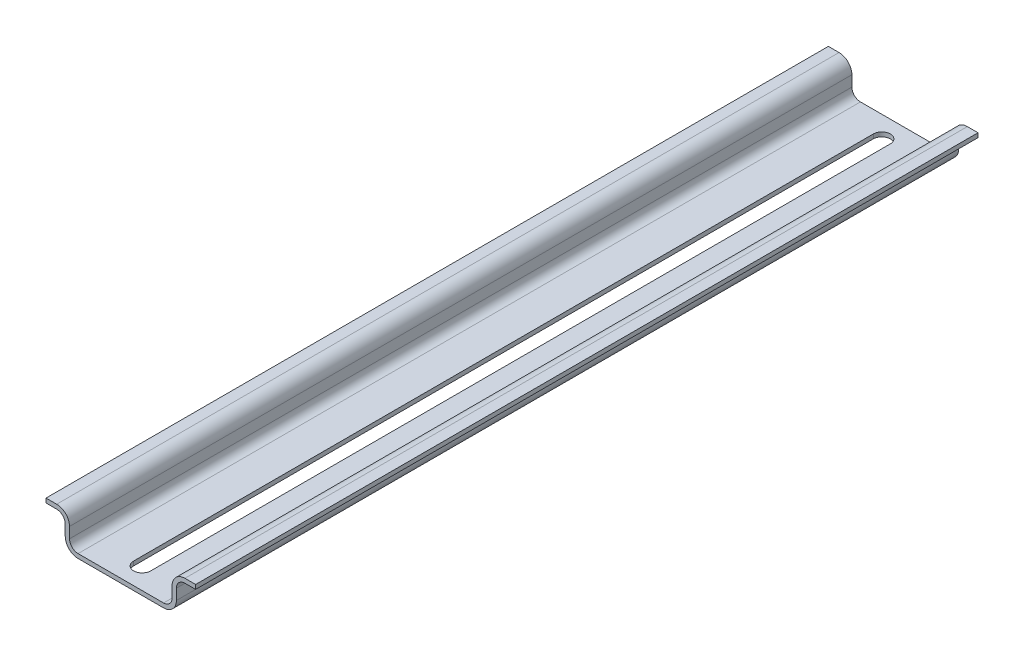
ISO-10303-21;
HEADER;
FILE_DESCRIPTION(('STEP AP214'),'2;1');
FILE_NAME('part.step','',(''),(''),'','','');
FILE_SCHEMA(('AUTOMOTIVE_DESIGN { 1 0 10303 214 1 1 1 1 }'));
ENDSEC;
DATA;
#1=APPLICATION_CONTEXT('core data for automotive mechanical design processes');
#2=APPLICATION_PROTOCOL_DEFINITION('international standard','automotive_design',2000,#1);
#3=PRODUCT_CONTEXT('',#1,'mechanical');
#4=PRODUCT('Part','Part','',(#3));
#5=PRODUCT_RELATED_PRODUCT_CATEGORY('part','',(#4));
#6=PRODUCT_DEFINITION_FORMATION('','',#4);
#7=PRODUCT_DEFINITION_CONTEXT('part definition',#1,'design');
#8=PRODUCT_DEFINITION('design','',#6,#7);
#9=PRODUCT_DEFINITION_SHAPE('','',#8);
#10=(LENGTH_UNIT() NAMED_UNIT(*) SI_UNIT(.MILLI.,.METRE.));
#11=(NAMED_UNIT(*) PLANE_ANGLE_UNIT() SI_UNIT($,.RADIAN.));
#12=(NAMED_UNIT(*) SI_UNIT($,.STERADIAN.) SOLID_ANGLE_UNIT());
#13=UNCERTAINTY_MEASURE_WITH_UNIT(LENGTH_MEASURE(1.E-05),#10,'distance_accuracy_value','');
#14=(GEOMETRIC_REPRESENTATION_CONTEXT(3) GLOBAL_UNCERTAINTY_ASSIGNED_CONTEXT((#13)) GLOBAL_UNIT_ASSIGNED_CONTEXT((#10,
#11,#12)) REPRESENTATION_CONTEXT('',''));
#15=CARTESIAN_POINT('',(0.,0.,0.));
#16=DIRECTION('',(0.,0.,1.));
#17=DIRECTION('',(1.,0.,0.));
#18=AXIS2_PLACEMENT_3D('',#15,#16,#17);
#19=CARTESIAN_POINT('',(0.,-1.72286102748374,183.));
#20=DIRECTION('',(1.,0.,0.));
#21=DIRECTION('',(0.,0.,-1.));
#22=AXIS2_PLACEMENT_3D('',#19,#20,#21);
#23=PLANE('',#22);
#24=DIRECTION('',(0.,-1.,0.));
#25=VECTOR('',#24,1.);
#26=CARTESIAN_POINT('',(0.,-1.72286102748374,0.));
#27=LINE('',#26,#25);
#28=CARTESIAN_POINT('',(0.,-1.72286102748374,0.));
#29=VERTEX_POINT('',#28);
#30=CARTESIAN_POINT('',(0.,-2.72286102748374,0.));
#31=VERTEX_POINT('',#30);
#32=EDGE_CURVE('E206',#29,#31,#27,.T.);
#33=ORIENTED_EDGE('',*,*,#32,.T.);
#34=DIRECTION('',(0.,0.,-1.));
#35=VECTOR('',#34,1.);
#36=CARTESIAN_POINT('',(0.,-2.72286102748374,183.));
#37=LINE('',#36,#35);
#38=CARTESIAN_POINT('',(0.,-2.72286102748374,183.));
#39=VERTEX_POINT('',#38);
#40=EDGE_CURVE('E11',#39,#31,#37,.T.);
#41=ORIENTED_EDGE('',*,*,#40,.F.);
#42=DIRECTION('',(0.,-1.,0.));
#43=VECTOR('',#42,1.);
#44=CARTESIAN_POINT('',(0.,-1.72286102748374,183.));
#45=LINE('',#44,#43);
#46=CARTESIAN_POINT('',(0.,-1.72286102748374,183.));
#47=VERTEX_POINT('',#46);
#48=EDGE_CURVE('E229',#47,#39,#45,.T.);
#49=ORIENTED_EDGE('',*,*,#48,.F.);
#50=DIRECTION('',(0.,0.,-1.));
#51=VECTOR('',#50,1.);
#52=CARTESIAN_POINT('',(0.,-1.72286102748374,183.));
#53=LINE('',#52,#51);
#54=EDGE_CURVE('E271',#47,#29,#53,.T.);
#55=ORIENTED_EDGE('',*,*,#54,.T.);
#56=EDGE_LOOP('',(#33,#41,#49,#55));
#57=FACE_BOUND('',#56,.T.);
#58=ADVANCED_FACE('F32',(#57),#23,.F.);
#59=CARTESIAN_POINT('',(0.,-2.72286102748374,183.));
#60=DIRECTION('',(0.,1.,0.));
#61=DIRECTION('',(0.,0.,1.));
#62=AXIS2_PLACEMENT_3D('',#59,#60,#61);
#63=PLANE('',#62);
#64=DIRECTION('',(1.,0.,0.));
#65=VECTOR('',#64,1.);
#66=CARTESIAN_POINT('',(0.,-2.72286102748374,0.));
#67=LINE('',#66,#65);
#68=CARTESIAN_POINT('',(2.5,-2.72286102748374,0.));
#69=VERTEX_POINT('',#68);
#70=EDGE_CURVE('E274',#31,#69,#67,.T.);
#71=ORIENTED_EDGE('',*,*,#70,.T.);
#72=DIRECTION('',(0.,0.,-1.));
#73=VECTOR('',#72,1.);
#74=CARTESIAN_POINT('',(2.5,-2.72286102748374,183.));
#75=LINE('',#74,#73);
#76=CARTESIAN_POINT('',(2.5,-2.72286102748374,183.));
#77=VERTEX_POINT('',#76);
#78=EDGE_CURVE('E39',#77,#69,#75,.T.);
#79=ORIENTED_EDGE('',*,*,#78,.F.);
#80=DIRECTION('',(1.,0.,0.));
#81=VECTOR('',#80,1.);
#82=CARTESIAN_POINT('',(0.,-2.72286102748374,183.));
#83=LINE('',#82,#81);
#84=EDGE_CURVE('E232',#39,#77,#83,.T.);
#85=ORIENTED_EDGE('',*,*,#84,.F.);
#86=ORIENTED_EDGE('',*,*,#40,.T.);
#87=EDGE_LOOP('',(#71,#79,#85,#86));
#88=FACE_BOUND('',#87,.T.);
#89=ADVANCED_FACE('F392',(#88),#63,.F.);
#90=CARTESIAN_POINT('',(2.5,-4.72286102748374,183.));
#91=DIRECTION('',(0.,0.,-1.));
#92=DIRECTION('',(-1.,0.,0.));
#93=AXIS2_PLACEMENT_3D('',#90,#91,#92);
#94=CYLINDRICAL_SURFACE('',#93,2.);
#95=CARTESIAN_POINT('',(2.5,-4.72286102748374,0.));
#96=DIRECTION('',(0.,0.,-1.));
#97=DIRECTION('',(1.,0.,0.));
#98=AXIS2_PLACEMENT_3D('',#95,#96,#97);
#99=CIRCLE('',#98,2.);
#100=CARTESIAN_POINT('',(4.5,-4.72286102748374,0.));
#101=VERTEX_POINT('',#100);
#102=EDGE_CURVE('E276',#69,#101,#99,.T.);
#103=ORIENTED_EDGE('',*,*,#102,.T.);
#104=DIRECTION('',(0.,0.,-1.));
#105=VECTOR('',#104,1.);
#106=CARTESIAN_POINT('',(4.5,-4.72286102748374,183.));
#107=LINE('',#106,#105);
#108=CARTESIAN_POINT('',(4.5,-4.72286102748374,183.));
#109=VERTEX_POINT('',#108);
#110=EDGE_CURVE('E363',#109,#101,#107,.T.);
#111=ORIENTED_EDGE('',*,*,#110,.F.);
#112=CARTESIAN_POINT('',(2.5,-4.72286102748374,183.));
#113=DIRECTION('',(0.,0.,-1.));
#114=DIRECTION('',(1.,0.,0.));
#115=AXIS2_PLACEMENT_3D('',#112,#113,#114);
#116=CIRCLE('',#115,2.);
#117=EDGE_CURVE('E235',#77,#109,#116,.T.);
#118=ORIENTED_EDGE('',*,*,#117,.F.);
#119=ORIENTED_EDGE('',*,*,#78,.T.);
#120=EDGE_LOOP('',(#103,#111,#118,#119));
#121=FACE_BOUND('',#120,.T.);
#122=ADVANCED_FACE('F370',(#121),#94,.F.);
#123=CARTESIAN_POINT('',(4.5,-4.72286102748374,183.));
#124=DIRECTION('',(1.,0.,0.));
#125=DIRECTION('',(0.,0.,-1.));
#126=AXIS2_PLACEMENT_3D('',#123,#124,#125);
#127=PLANE('',#126);
#128=DIRECTION('',(0.,-1.,0.));
#129=VECTOR('',#128,1.);
#130=CARTESIAN_POINT('',(4.5,-4.72286102748374,0.));
#131=LINE('',#130,#129);
#132=CARTESIAN_POINT('',(4.5,-7.22286102748374,0.));
#133=VERTEX_POINT('',#132);
#134=EDGE_CURVE('E278',#101,#133,#131,.T.);
#135=ORIENTED_EDGE('',*,*,#134,.T.);
#136=DIRECTION('',(0.,0.,-1.));
#137=VECTOR('',#136,1.);
#138=CARTESIAN_POINT('',(4.5,-7.22286102748374,183.));
#139=LINE('',#138,#137);
#140=CARTESIAN_POINT('',(4.5,-7.22286102748374,183.));
#141=VERTEX_POINT('',#140);
#142=EDGE_CURVE('E360',#141,#133,#139,.T.);
#143=ORIENTED_EDGE('',*,*,#142,.F.);
#144=DIRECTION('',(0.,-1.,0.));
#145=VECTOR('',#144,1.);
#146=CARTESIAN_POINT('',(4.5,-4.72286102748374,183.));
#147=LINE('',#146,#145);
#148=EDGE_CURVE('E237',#109,#141,#147,.T.);
#149=ORIENTED_EDGE('',*,*,#148,.F.);
#150=ORIENTED_EDGE('',*,*,#110,.T.);
#151=EDGE_LOOP('',(#135,#143,#149,#150));
#152=FACE_BOUND('',#151,.T.);
#153=ADVANCED_FACE('F380',(#152),#127,.F.);
#154=CARTESIAN_POINT('',(7.5,-7.22286102748374,183.));
#155=DIRECTION('',(0.,0.,-1.));
#156=DIRECTION('',(-1.,0.,0.));
#157=AXIS2_PLACEMENT_3D('',#154,#155,#156);
#158=CYLINDRICAL_SURFACE('',#157,3.);
#159=CARTESIAN_POINT('',(7.5,-7.22286102748374,0.));
#160=DIRECTION('',(0.,0.,1.));
#161=DIRECTION('',(-1.,0.,0.));
#162=AXIS2_PLACEMENT_3D('',#159,#160,#161);
#163=CIRCLE('',#162,3.);
#164=CARTESIAN_POINT('',(7.5,-10.2228610274837,0.));
#165=VERTEX_POINT('',#164);
#166=EDGE_CURVE('E280',#133,#165,#163,.T.);
#167=ORIENTED_EDGE('',*,*,#166,.T.);
#168=DIRECTION('',(0.,0.,-1.));
#169=VECTOR('',#168,1.);
#170=CARTESIAN_POINT('',(7.5,-10.2228610274837,183.));
#171=LINE('',#170,#169);
#172=CARTESIAN_POINT('',(7.5,-10.2228610274837,183.));
#173=VERTEX_POINT('',#172);
#174=EDGE_CURVE('E357',#173,#165,#171,.T.);
#175=ORIENTED_EDGE('',*,*,#174,.F.);
#176=CARTESIAN_POINT('',(7.5,-7.22286102748374,183.));
#177=DIRECTION('',(0.,0.,1.));
#178=DIRECTION('',(-1.,0.,0.));
#179=AXIS2_PLACEMENT_3D('',#176,#177,#178);
#180=CIRCLE('',#179,3.);
#181=EDGE_CURVE('E239',#141,#173,#180,.T.);
#182=ORIENTED_EDGE('',*,*,#181,.F.);
#183=ORIENTED_EDGE('',*,*,#142,.T.);
#184=EDGE_LOOP('',(#167,#175,#182,#183));
#185=FACE_BOUND('',#184,.T.);
#186=ADVANCED_FACE('F384',(#185),#158,.T.);
#187=CARTESIAN_POINT('',(27.5,-10.2228610274837,183.));
#188=DIRECTION('',(0.,1.,0.));
#189=DIRECTION('',(-1.,0.,0.));
#190=AXIS2_PLACEMENT_3D('',#187,#188,#189);
#191=PLANE('',#190);
#192=DIRECTION('',(0.,0.,-1.));
#193=VECTOR('',#192,1.);
#194=CARTESIAN_POINT('',(15.5,-10.2228610274837,178.));
#195=LINE('',#194,#193);
#196=CARTESIAN_POINT('',(15.5,-10.2228610274837,178.));
#197=VERTEX_POINT('',#196);
#198=CARTESIAN_POINT('',(15.5,-10.2228610274837,5.));
#199=VERTEX_POINT('',#198);
#200=EDGE_CURVE('E212',#197,#199,#195,.T.);
#201=ORIENTED_EDGE('',*,*,#200,.F.);
#202=CARTESIAN_POINT('',(17.5,-10.2228610274837,178.));
#203=DIRECTION('',(0.,1.,0.));
#204=DIRECTION('',(-1.,0.,0.));
#205=AXIS2_PLACEMENT_3D('',#202,#203,#204);
#206=CIRCLE('',#205,2.);
#207=CARTESIAN_POINT('',(19.5,-10.2228610274837,178.));
#208=VERTEX_POINT('',#207);
#209=EDGE_CURVE('E194',#208,#197,#206,.F.);
#210=ORIENTED_EDGE('',*,*,#209,.F.);
#211=DIRECTION('',(0.,0.,1.));
#212=VECTOR('',#211,1.);
#213=CARTESIAN_POINT('',(19.5,-10.2228610274837,178.));
#214=LINE('',#213,#212);
#215=CARTESIAN_POINT('',(19.5,-10.2228610274837,5.));
#216=VERTEX_POINT('',#215);
#217=EDGE_CURVE('E203',#216,#208,#214,.T.);
#218=ORIENTED_EDGE('',*,*,#217,.F.);
#219=CARTESIAN_POINT('',(17.5,-10.2228610274837,5.));
#220=DIRECTION('',(0.,1.,0.));
#221=DIRECTION('',(-1.,0.,0.));
#222=AXIS2_PLACEMENT_3D('',#219,#220,#221);
#223=CIRCLE('',#222,2.);
#224=EDGE_CURVE('E46',#199,#216,#223,.F.);
#225=ORIENTED_EDGE('',*,*,#224,.F.);
#226=EDGE_LOOP('',(#201,#210,#218,#225));
#227=FACE_BOUND('',#226,.T.);
#228=DIRECTION('',(1.,0.,0.));
#229=VECTOR('',#228,1.);
#230=CARTESIAN_POINT('',(27.5,-10.2228610274837,0.));
#231=LINE('',#230,#229);
#232=CARTESIAN_POINT('',(27.5,-10.2228610274837,0.));
#233=VERTEX_POINT('',#232);
#234=EDGE_CURVE('E283',#165,#233,#231,.T.);
#235=ORIENTED_EDGE('',*,*,#234,.T.);
#236=DIRECTION('',(0.,0.,-1.));
#237=VECTOR('',#236,1.);
#238=CARTESIAN_POINT('',(27.5,-10.2228610274837,183.));
#239=LINE('',#238,#237);
#240=CARTESIAN_POINT('',(27.5,-10.2228610274837,183.));
#241=VERTEX_POINT('',#240);
#242=EDGE_CURVE('E354',#241,#233,#239,.T.);
#243=ORIENTED_EDGE('',*,*,#242,.F.);
#244=DIRECTION('',(1.,0.,0.));
#245=VECTOR('',#244,1.);
#246=CARTESIAN_POINT('',(7.5,-10.2228610274837,183.));
#247=LINE('',#246,#245);
#248=EDGE_CURVE('E241',#173,#241,#247,.T.);
#249=ORIENTED_EDGE('',*,*,#248,.F.);
#250=ORIENTED_EDGE('',*,*,#174,.T.);
#251=EDGE_LOOP('',(#235,#243,#249,#250));
#252=FACE_BOUND('',#251,.T.);
#253=ADVANCED_FACE('F209',(#227,#252),#191,.F.);
#254=CARTESIAN_POINT('',(27.5,-7.22286102748374,183.));
#255=DIRECTION('',(0.,0.,-1.));
#256=DIRECTION('',(-1.,0.,0.));
#257=AXIS2_PLACEMENT_3D('',#254,#255,#256);
#258=CYLINDRICAL_SURFACE('',#257,3.);
#259=CARTESIAN_POINT('',(27.5,-7.22286102748374,0.));
#260=DIRECTION('',(0.,0.,1.));
#261=DIRECTION('',(1.,0.,0.));
#262=AXIS2_PLACEMENT_3D('',#259,#260,#261);
#263=CIRCLE('',#262,3.);
#264=CARTESIAN_POINT('',(30.5,-7.22286102748374,0.));
#265=VERTEX_POINT('',#264);
#266=EDGE_CURVE('E285',#233,#265,#263,.T.);
#267=ORIENTED_EDGE('',*,*,#266,.T.);
#268=DIRECTION('',(0.,0.,-1.));
#269=VECTOR('',#268,1.);
#270=CARTESIAN_POINT('',(30.5,-7.22286102748374,183.));
#271=LINE('',#270,#269);
#272=CARTESIAN_POINT('',(30.5,-7.22286102748374,183.));
#273=VERTEX_POINT('',#272);
#274=EDGE_CURVE('E351',#273,#265,#271,.T.);
#275=ORIENTED_EDGE('',*,*,#274,.F.);
#276=CARTESIAN_POINT('',(27.5,-7.22286102748374,183.));
#277=DIRECTION('',(0.,0.,1.));
#278=DIRECTION('',(1.,0.,0.));
#279=AXIS2_PLACEMENT_3D('',#276,#277,#278);
#280=CIRCLE('',#279,3.);
#281=EDGE_CURVE('E243',#241,#273,#280,.T.);
#282=ORIENTED_EDGE('',*,*,#281,.F.);
#283=ORIENTED_EDGE('',*,*,#242,.T.);
#284=EDGE_LOOP('',(#267,#275,#282,#283));
#285=FACE_BOUND('',#284,.T.);
#286=ADVANCED_FACE('F462',(#285),#258,.T.);
#287=CARTESIAN_POINT('',(30.5,-4.72286102748374,183.));
#288=DIRECTION('',(-1.,0.,0.));
#289=DIRECTION('',(0.,0.,1.));
#290=AXIS2_PLACEMENT_3D('',#287,#288,#289);
#291=PLANE('',#290);
#292=DIRECTION('',(0.,1.,0.));
#293=VECTOR('',#292,1.);
#294=CARTESIAN_POINT('',(30.5,-4.72286102748374,0.));
#295=LINE('',#294,#293);
#296=CARTESIAN_POINT('',(30.5,-4.72286102748374,0.));
#297=VERTEX_POINT('',#296);
#298=EDGE_CURVE('E287',#265,#297,#295,.T.);
#299=ORIENTED_EDGE('',*,*,#298,.T.);
#300=DIRECTION('',(0.,0.,-1.));
#301=VECTOR('',#300,1.);
#302=CARTESIAN_POINT('',(30.5,-4.72286102748374,183.));
#303=LINE('',#302,#301);
#304=CARTESIAN_POINT('',(30.5,-4.72286102748374,183.));
#305=VERTEX_POINT('',#304);
#306=EDGE_CURVE('E348',#305,#297,#303,.T.);
#307=ORIENTED_EDGE('',*,*,#306,.F.);
#308=DIRECTION('',(0.,1.,0.));
#309=VECTOR('',#308,1.);
#310=CARTESIAN_POINT('',(30.5,-4.72286102748374,183.));
#311=LINE('',#310,#309);
#312=EDGE_CURVE('E245',#273,#305,#311,.T.);
#313=ORIENTED_EDGE('',*,*,#312,.F.);
#314=ORIENTED_EDGE('',*,*,#274,.T.);
#315=EDGE_LOOP('',(#299,#307,#313,#314));
#316=FACE_BOUND('',#315,.T.);
#317=ADVANCED_FACE('F457',(#316),#291,.F.);
#318=CARTESIAN_POINT('',(32.5,-4.72286102748374,183.));
#319=DIRECTION('',(0.,0.,-1.));
#320=DIRECTION('',(-1.,0.,0.));
#321=AXIS2_PLACEMENT_3D('',#318,#319,#320);
#322=CYLINDRICAL_SURFACE('',#321,2.);
#323=CARTESIAN_POINT('',(32.5,-4.72286102748374,0.));
#324=DIRECTION('',(0.,0.,-1.));
#325=DIRECTION('',(-1.,0.,0.));
#326=AXIS2_PLACEMENT_3D('',#323,#324,#325);
#327=CIRCLE('',#326,2.);
#328=CARTESIAN_POINT('',(32.5,-2.72286102748375,0.));
#329=VERTEX_POINT('',#328);
#330=EDGE_CURVE('E289',#297,#329,#327,.T.);
#331=ORIENTED_EDGE('',*,*,#330,.T.);
#332=DIRECTION('',(0.,0.,-1.));
#333=VECTOR('',#332,1.);
#334=CARTESIAN_POINT('',(32.5,-2.72286102748375,183.));
#335=LINE('',#334,#333);
#336=CARTESIAN_POINT('',(32.5,-2.72286102748375,183.));
#337=VERTEX_POINT('',#336);
#338=EDGE_CURVE('E345',#337,#329,#335,.T.);
#339=ORIENTED_EDGE('',*,*,#338,.F.);
#340=CARTESIAN_POINT('',(32.5,-4.72286102748374,183.));
#341=DIRECTION('',(0.,0.,-1.));
#342=DIRECTION('',(-1.,0.,0.));
#343=AXIS2_PLACEMENT_3D('',#340,#341,#342);
#344=CIRCLE('',#343,2.);
#345=EDGE_CURVE('E247',#305,#337,#344,.T.);
#346=ORIENTED_EDGE('',*,*,#345,.F.);
#347=ORIENTED_EDGE('',*,*,#306,.T.);
#348=EDGE_LOOP('',(#331,#339,#346,#347));
#349=FACE_BOUND('',#348,.T.);
#350=ADVANCED_FACE('F452',(#349),#322,.F.);
#351=CARTESIAN_POINT('',(35.,-2.72286102748374,183.));
#352=DIRECTION('',(0.,1.,0.));
#353=DIRECTION('',(0.,0.,1.));
#354=AXIS2_PLACEMENT_3D('',#351,#352,#353);
#355=PLANE('',#354);
#356=DIRECTION('',(1.,0.,0.));
#357=VECTOR('',#356,1.);
#358=CARTESIAN_POINT('',(35.,-2.72286102748374,0.));
#359=LINE('',#358,#357);
#360=CARTESIAN_POINT('',(35.,-2.72286102748374,0.));
#361=VERTEX_POINT('',#360);
#362=EDGE_CURVE('E291',#329,#361,#359,.T.);
#363=ORIENTED_EDGE('',*,*,#362,.T.);
#364=DIRECTION('',(0.,0.,-1.));
#365=VECTOR('',#364,1.);
#366=CARTESIAN_POINT('',(35.,-2.72286102748374,183.));
#367=LINE('',#366,#365);
#368=CARTESIAN_POINT('',(35.,-2.72286102748374,183.));
#369=VERTEX_POINT('',#368);
#370=EDGE_CURVE('E342',#369,#361,#367,.T.);
#371=ORIENTED_EDGE('',*,*,#370,.F.);
#372=DIRECTION('',(1.,0.,0.));
#373=VECTOR('',#372,1.);
#374=CARTESIAN_POINT('',(35.,-2.72286102748374,183.));
#375=LINE('',#374,#373);
#376=EDGE_CURVE('E249',#337,#369,#375,.T.);
#377=ORIENTED_EDGE('',*,*,#376,.F.);
#378=ORIENTED_EDGE('',*,*,#338,.T.);
#379=EDGE_LOOP('',(#363,#371,#377,#378));
#380=FACE_BOUND('',#379,.T.);
#381=ADVANCED_FACE('F448',(#380),#355,.F.);
#382=CARTESIAN_POINT('',(35.,-1.72286102748374,183.));
#383=DIRECTION('',(-1.,0.,0.));
#384=DIRECTION('',(0.,0.,1.));
#385=AXIS2_PLACEMENT_3D('',#382,#383,#384);
#386=PLANE('',#385);
#387=DIRECTION('',(0.,1.,0.));
#388=VECTOR('',#387,1.);
#389=CARTESIAN_POINT('',(35.,-1.72286102748374,0.));
#390=LINE('',#389,#388);
#391=CARTESIAN_POINT('',(35.,-1.72286102748374,0.));
#392=VERTEX_POINT('',#391);
#393=EDGE_CURVE('E293',#361,#392,#390,.T.);
#394=ORIENTED_EDGE('',*,*,#393,.T.);
#395=DIRECTION('',(0.,0.,-1.));
#396=VECTOR('',#395,1.);
#397=CARTESIAN_POINT('',(35.,-1.72286102748374,183.));
#398=LINE('',#397,#396);
#399=CARTESIAN_POINT('',(35.,-1.72286102748374,183.));
#400=VERTEX_POINT('',#399);
#401=EDGE_CURVE('E339',#400,#392,#398,.T.);
#402=ORIENTED_EDGE('',*,*,#401,.F.);
#403=DIRECTION('',(0.,1.,0.));
#404=VECTOR('',#403,1.);
#405=CARTESIAN_POINT('',(35.,-1.72286102748374,183.));
#406=LINE('',#405,#404);
#407=EDGE_CURVE('E251',#369,#400,#406,.T.);
#408=ORIENTED_EDGE('',*,*,#407,.F.);
#409=ORIENTED_EDGE('',*,*,#370,.T.);
#410=EDGE_LOOP('',(#394,#402,#408,#409));
#411=FACE_BOUND('',#410,.T.);
#412=ADVANCED_FACE('F443',(#411),#386,.F.);
#413=CARTESIAN_POINT('',(35.,-1.72286102748374,183.));
#414=DIRECTION('',(0.,-1.,0.));
#415=DIRECTION('',(0.,0.,-1.));
#416=AXIS2_PLACEMENT_3D('',#413,#414,#415);
#417=PLANE('',#416);
#418=DIRECTION('',(-1.,0.,0.));
#419=VECTOR('',#418,1.);
#420=CARTESIAN_POINT('',(35.,-1.72286102748374,0.));
#421=LINE('',#420,#419);
#422=CARTESIAN_POINT('',(32.5,-1.72286102748374,0.));
#423=VERTEX_POINT('',#422);
#424=EDGE_CURVE('E295',#392,#423,#421,.T.);
#425=ORIENTED_EDGE('',*,*,#424,.T.);
#426=DIRECTION('',(0.,0.,-1.));
#427=VECTOR('',#426,1.);
#428=CARTESIAN_POINT('',(32.5,-1.72286102748374,183.));
#429=LINE('',#428,#427);
#430=CARTESIAN_POINT('',(32.5,-1.72286102748374,183.));
#431=VERTEX_POINT('',#430);
#432=EDGE_CURVE('E336',#431,#423,#429,.T.);
#433=ORIENTED_EDGE('',*,*,#432,.F.);
#434=DIRECTION('',(-1.,0.,0.));
#435=VECTOR('',#434,1.);
#436=CARTESIAN_POINT('',(35.,-1.72286102748374,183.));
#437=LINE('',#436,#435);
#438=EDGE_CURVE('E253',#400,#431,#437,.T.);
#439=ORIENTED_EDGE('',*,*,#438,.F.);
#440=ORIENTED_EDGE('',*,*,#401,.T.);
#441=EDGE_LOOP('',(#425,#433,#439,#440));
#442=FACE_BOUND('',#441,.T.);
#443=ADVANCED_FACE('F437',(#442),#417,.F.);
#444=CARTESIAN_POINT('',(32.5,-4.72286102748374,183.));
#445=DIRECTION('',(0.,0.,-1.));
#446=DIRECTION('',(-1.,0.,0.));
#447=AXIS2_PLACEMENT_3D('',#444,#445,#446);
#448=CYLINDRICAL_SURFACE('',#447,3.);
#449=CARTESIAN_POINT('',(32.5,-4.72286102748374,0.));
#450=DIRECTION('',(0.,0.,1.));
#451=DIRECTION('',(-1.,0.,0.));
#452=AXIS2_PLACEMENT_3D('',#449,#450,#451);
#453=CIRCLE('',#452,3.);
#454=CARTESIAN_POINT('',(29.5,-4.72286102748374,0.));
#455=VERTEX_POINT('',#454);
#456=EDGE_CURVE('E297',#423,#455,#453,.T.);
#457=ORIENTED_EDGE('',*,*,#456,.T.);
#458=DIRECTION('',(0.,0.,-1.));
#459=VECTOR('',#458,1.);
#460=CARTESIAN_POINT('',(29.5,-4.72286102748374,183.));
#461=LINE('',#460,#459);
#462=CARTESIAN_POINT('',(29.5,-4.72286102748374,183.));
#463=VERTEX_POINT('',#462);
#464=EDGE_CURVE('E333',#463,#455,#461,.T.);
#465=ORIENTED_EDGE('',*,*,#464,.F.);
#466=CARTESIAN_POINT('',(32.5,-4.72286102748374,183.));
#467=DIRECTION('',(0.,0.,1.));
#468=DIRECTION('',(-1.,0.,0.));
#469=AXIS2_PLACEMENT_3D('',#466,#467,#468);
#470=CIRCLE('',#469,3.);
#471=EDGE_CURVE('E255',#431,#463,#470,.T.);
#472=ORIENTED_EDGE('',*,*,#471,.F.);
#473=ORIENTED_EDGE('',*,*,#432,.T.);
#474=EDGE_LOOP('',(#457,#465,#472,#473));
#475=FACE_BOUND('',#474,.T.);
#476=ADVANCED_FACE('F433',(#475),#448,.T.);
#477=CARTESIAN_POINT('',(29.5,-4.72286102748374,183.));
#478=DIRECTION('',(1.,0.,0.));
#479=DIRECTION('',(0.,0.,-1.));
#480=AXIS2_PLACEMENT_3D('',#477,#478,#479);
#481=PLANE('',#480);
#482=DIRECTION('',(0.,-1.,0.));
#483=VECTOR('',#482,1.);
#484=CARTESIAN_POINT('',(29.5,-4.72286102748374,0.));
#485=LINE('',#484,#483);
#486=CARTESIAN_POINT('',(29.5,-7.22286102748374,0.));
#487=VERTEX_POINT('',#486);
#488=EDGE_CURVE('E299',#455,#487,#485,.T.);
#489=ORIENTED_EDGE('',*,*,#488,.T.);
#490=DIRECTION('',(0.,0.,-1.));
#491=VECTOR('',#490,1.);
#492=CARTESIAN_POINT('',(29.5,-7.22286102748374,183.));
#493=LINE('',#492,#491);
#494=CARTESIAN_POINT('',(29.5,-7.22286102748374,183.));
#495=VERTEX_POINT('',#494);
#496=EDGE_CURVE('E330',#495,#487,#493,.T.);
#497=ORIENTED_EDGE('',*,*,#496,.F.);
#498=DIRECTION('',(0.,-1.,0.));
#499=VECTOR('',#498,1.);
#500=CARTESIAN_POINT('',(29.5,-4.72286102748374,183.));
#501=LINE('',#500,#499);
#502=EDGE_CURVE('E257',#463,#495,#501,.T.);
#503=ORIENTED_EDGE('',*,*,#502,.F.);
#504=ORIENTED_EDGE('',*,*,#464,.T.);
#505=EDGE_LOOP('',(#489,#497,#503,#504));
#506=FACE_BOUND('',#505,.T.);
#507=ADVANCED_FACE('F428',(#506),#481,.F.);
#508=CARTESIAN_POINT('',(27.5,-7.22286102748374,183.));
#509=DIRECTION('',(0.,0.,-1.));
#510=DIRECTION('',(-1.,0.,0.));
#511=AXIS2_PLACEMENT_3D('',#508,#509,#510);
#512=CYLINDRICAL_SURFACE('',#511,2.);
#513=CARTESIAN_POINT('',(27.5,-7.22286102748374,0.));
#514=DIRECTION('',(0.,0.,-1.));
#515=DIRECTION('',(1.,0.,0.));
#516=AXIS2_PLACEMENT_3D('',#513,#514,#515);
#517=CIRCLE('',#516,2.);
#518=CARTESIAN_POINT('',(27.5,-9.22286102748374,0.));
#519=VERTEX_POINT('',#518);
#520=EDGE_CURVE('E301',#487,#519,#517,.T.);
#521=ORIENTED_EDGE('',*,*,#520,.T.);
#522=DIRECTION('',(0.,0.,-1.));
#523=VECTOR('',#522,1.);
#524=CARTESIAN_POINT('',(27.5,-9.22286102748374,183.));
#525=LINE('',#524,#523);
#526=CARTESIAN_POINT('',(27.5,-9.22286102748374,183.));
#527=VERTEX_POINT('',#526);
#528=EDGE_CURVE('E327',#527,#519,#525,.T.);
#529=ORIENTED_EDGE('',*,*,#528,.F.);
#530=CARTESIAN_POINT('',(27.5,-7.22286102748374,183.));
#531=DIRECTION('',(0.,0.,-1.));
#532=DIRECTION('',(1.,0.,0.));
#533=AXIS2_PLACEMENT_3D('',#530,#531,#532);
#534=CIRCLE('',#533,2.);
#535=EDGE_CURVE('E259',#495,#527,#534,.T.);
#536=ORIENTED_EDGE('',*,*,#535,.F.);
#537=ORIENTED_EDGE('',*,*,#496,.T.);
#538=EDGE_LOOP('',(#521,#529,#536,#537));
#539=FACE_BOUND('',#538,.T.);
#540=ADVANCED_FACE('F422',(#539),#512,.F.);
#541=CARTESIAN_POINT('',(7.5,-9.22286102748374,183.));
#542=DIRECTION('',(0.,-1.,0.));
#543=DIRECTION('',(0.,0.,-1.));
#544=AXIS2_PLACEMENT_3D('',#541,#542,#543);
#545=PLANE('',#544);
#546=DIRECTION('',(0.,0.,-1.));
#547=VECTOR('',#546,1.);
#548=CARTESIAN_POINT('',(19.5,-9.22286102748374,178.));
#549=LINE('',#548,#547);
#550=CARTESIAN_POINT('',(19.5,-9.22286102748374,178.));
#551=VERTEX_POINT('',#550);
#552=CARTESIAN_POINT('',(19.5,-9.22286102748374,5.));
#553=VERTEX_POINT('',#552);
#554=EDGE_CURVE('E214',#551,#553,#549,.T.);
#555=ORIENTED_EDGE('',*,*,#554,.F.);
#556=CARTESIAN_POINT('',(17.5,-9.22286102748374,178.));
#557=DIRECTION('',(0.,1.,0.));
#558=DIRECTION('',(0.,0.,1.));
#559=AXIS2_PLACEMENT_3D('',#556,#557,#558);
#560=CIRCLE('',#559,2.);
#561=CARTESIAN_POINT('',(15.5,-9.22286102748374,178.));
#562=VERTEX_POINT('',#561);
#563=EDGE_CURVE('E54',#562,#551,#560,.T.);
#564=ORIENTED_EDGE('',*,*,#563,.F.);
#565=DIRECTION('',(0.,0.,1.));
#566=VECTOR('',#565,1.);
#567=CARTESIAN_POINT('',(15.5,-9.22286102748374,178.));
#568=LINE('',#567,#566);
#569=CARTESIAN_POINT('',(15.5,-9.22286102748374,5.));
#570=VERTEX_POINT('',#569);
#571=EDGE_CURVE('E200',#570,#562,#568,.T.);
#572=ORIENTED_EDGE('',*,*,#571,.F.);
#573=CARTESIAN_POINT('',(17.5,-9.22286102748374,5.));
#574=DIRECTION('',(0.,1.,0.));
#575=DIRECTION('',(0.,0.,1.));
#576=AXIS2_PLACEMENT_3D('',#573,#574,#575);
#577=CIRCLE('',#576,2.);
#578=EDGE_CURVE('E220',#553,#570,#577,.T.);
#579=ORIENTED_EDGE('',*,*,#578,.F.);
#580=EDGE_LOOP('',(#555,#564,#572,#579));
#581=FACE_BOUND('',#580,.T.);
#582=DIRECTION('',(-1.,0.,0.));
#583=VECTOR('',#582,1.);
#584=CARTESIAN_POINT('',(7.5,-9.22286102748374,0.));
#585=LINE('',#584,#583);
#586=CARTESIAN_POINT('',(7.5,-9.22286102748374,0.));
#587=VERTEX_POINT('',#586);
#588=EDGE_CURVE('E304',#519,#587,#585,.T.);
#589=ORIENTED_EDGE('',*,*,#588,.T.);
#590=DIRECTION('',(0.,0.,-1.));
#591=VECTOR('',#590,1.);
#592=CARTESIAN_POINT('',(7.5,-9.22286102748374,183.));
#593=LINE('',#592,#591);
#594=CARTESIAN_POINT('',(7.5,-9.22286102748374,183.));
#595=VERTEX_POINT('',#594);
#596=EDGE_CURVE('E324',#595,#587,#593,.T.);
#597=ORIENTED_EDGE('',*,*,#596,.F.);
#598=DIRECTION('',(-1.,0.,0.));
#599=VECTOR('',#598,1.);
#600=CARTESIAN_POINT('',(27.5,-9.22286102748374,183.));
#601=LINE('',#600,#599);
#602=EDGE_CURVE('E261',#527,#595,#601,.T.);
#603=ORIENTED_EDGE('',*,*,#602,.F.);
#604=ORIENTED_EDGE('',*,*,#528,.T.);
#605=EDGE_LOOP('',(#589,#597,#603,#604));
#606=FACE_BOUND('',#605,.T.);
#607=ADVANCED_FACE('F418',(#581,#606),#545,.F.);
#608=CARTESIAN_POINT('',(7.5,-7.22286102748374,183.));
#609=DIRECTION('',(0.,0.,-1.));
#610=DIRECTION('',(-1.,0.,0.));
#611=AXIS2_PLACEMENT_3D('',#608,#609,#610);
#612=CYLINDRICAL_SURFACE('',#611,2.);
#613=CARTESIAN_POINT('',(7.5,-7.22286102748374,0.));
#614=DIRECTION('',(0.,0.,-1.));
#615=DIRECTION('',(-1.,0.,0.));
#616=AXIS2_PLACEMENT_3D('',#613,#614,#615);
#617=CIRCLE('',#616,2.);
#618=CARTESIAN_POINT('',(5.5,-7.22286102748374,0.));
#619=VERTEX_POINT('',#618);
#620=EDGE_CURVE('E306',#587,#619,#617,.T.);
#621=ORIENTED_EDGE('',*,*,#620,.T.);
#622=DIRECTION('',(0.,0.,-1.));
#623=VECTOR('',#622,1.);
#624=CARTESIAN_POINT('',(5.5,-7.22286102748374,183.));
#625=LINE('',#624,#623);
#626=CARTESIAN_POINT('',(5.5,-7.22286102748374,183.));
#627=VERTEX_POINT('',#626);
#628=EDGE_CURVE('E321',#627,#619,#625,.T.);
#629=ORIENTED_EDGE('',*,*,#628,.F.);
#630=CARTESIAN_POINT('',(7.5,-7.22286102748374,183.));
#631=DIRECTION('',(0.,0.,-1.));
#632=DIRECTION('',(-1.,0.,0.));
#633=AXIS2_PLACEMENT_3D('',#630,#631,#632);
#634=CIRCLE('',#633,2.);
#635=EDGE_CURVE('E263',#595,#627,#634,.T.);
#636=ORIENTED_EDGE('',*,*,#635,.F.);
#637=ORIENTED_EDGE('',*,*,#596,.T.);
#638=EDGE_LOOP('',(#621,#629,#636,#637));
#639=FACE_BOUND('',#638,.T.);
#640=ADVANCED_FACE('F413',(#639),#612,.F.);
#641=CARTESIAN_POINT('',(5.5,-4.72286102748374,183.));
#642=DIRECTION('',(-1.,0.,0.));
#643=DIRECTION('',(0.,0.,1.));
#644=AXIS2_PLACEMENT_3D('',#641,#642,#643);
#645=PLANE('',#644);
#646=DIRECTION('',(0.,1.,0.));
#647=VECTOR('',#646,1.);
#648=CARTESIAN_POINT('',(5.5,-4.72286102748374,0.));
#649=LINE('',#648,#647);
#650=CARTESIAN_POINT('',(5.5,-4.72286102748374,0.));
#651=VERTEX_POINT('',#650);
#652=EDGE_CURVE('E308',#619,#651,#649,.T.);
#653=ORIENTED_EDGE('',*,*,#652,.T.);
#654=DIRECTION('',(0.,0.,-1.));
#655=VECTOR('',#654,1.);
#656=CARTESIAN_POINT('',(5.5,-4.72286102748374,183.));
#657=LINE('',#656,#655);
#658=CARTESIAN_POINT('',(5.5,-4.72286102748374,183.));
#659=VERTEX_POINT('',#658);
#660=EDGE_CURVE('E318',#659,#651,#657,.T.);
#661=ORIENTED_EDGE('',*,*,#660,.F.);
#662=DIRECTION('',(0.,1.,0.));
#663=VECTOR('',#662,1.);
#664=CARTESIAN_POINT('',(5.5,-4.72286102748374,183.));
#665=LINE('',#664,#663);
#666=EDGE_CURVE('E265',#627,#659,#665,.T.);
#667=ORIENTED_EDGE('',*,*,#666,.F.);
#668=ORIENTED_EDGE('',*,*,#628,.T.);
#669=EDGE_LOOP('',(#653,#661,#667,#668));
#670=FACE_BOUND('',#669,.T.);
#671=ADVANCED_FACE('F408',(#670),#645,.F.);
#672=CARTESIAN_POINT('',(2.5,-4.72286102748374,183.));
#673=DIRECTION('',(0.,0.,-1.));
#674=DIRECTION('',(-1.,0.,0.));
#675=AXIS2_PLACEMENT_3D('',#672,#673,#674);
#676=CYLINDRICAL_SURFACE('',#675,3.);
#677=CARTESIAN_POINT('',(2.5,-4.72286102748374,0.));
#678=DIRECTION('',(0.,0.,1.));
#679=DIRECTION('',(1.,0.,0.));
#680=AXIS2_PLACEMENT_3D('',#677,#678,#679);
#681=CIRCLE('',#680,3.);
#682=CARTESIAN_POINT('',(2.5,-1.72286102748374,0.));
#683=VERTEX_POINT('',#682);
#684=EDGE_CURVE('E310',#651,#683,#681,.T.);
#685=ORIENTED_EDGE('',*,*,#684,.T.);
#686=DIRECTION('',(0.,0.,-1.));
#687=VECTOR('',#686,1.);
#688=CARTESIAN_POINT('',(2.5,-1.72286102748374,183.));
#689=LINE('',#688,#687);
#690=CARTESIAN_POINT('',(2.5,-1.72286102748374,183.));
#691=VERTEX_POINT('',#690);
#692=EDGE_CURVE('E315',#691,#683,#689,.T.);
#693=ORIENTED_EDGE('',*,*,#692,.F.);
#694=CARTESIAN_POINT('',(2.5,-4.72286102748374,183.));
#695=DIRECTION('',(0.,0.,1.));
#696=DIRECTION('',(1.,0.,0.));
#697=AXIS2_PLACEMENT_3D('',#694,#695,#696);
#698=CIRCLE('',#697,3.);
#699=EDGE_CURVE('E267',#659,#691,#698,.T.);
#700=ORIENTED_EDGE('',*,*,#699,.F.);
#701=ORIENTED_EDGE('',*,*,#660,.T.);
#702=EDGE_LOOP('',(#685,#693,#700,#701));
#703=FACE_BOUND('',#702,.T.);
#704=ADVANCED_FACE('F404',(#703),#676,.T.);
#705=CARTESIAN_POINT('',(0.,-1.72286102748374,183.));
#706=DIRECTION('',(0.,-1.,0.));
#707=DIRECTION('',(0.,0.,-1.));
#708=AXIS2_PLACEMENT_3D('',#705,#706,#707);
#709=PLANE('',#708);
#710=DIRECTION('',(-1.,0.,0.));
#711=VECTOR('',#710,1.);
#712=CARTESIAN_POINT('',(0.,-1.72286102748374,0.));
#713=LINE('',#712,#711);
#714=EDGE_CURVE('E233',#683,#29,#713,.T.);
#715=ORIENTED_EDGE('',*,*,#714,.T.);
#716=ORIENTED_EDGE('',*,*,#54,.F.);
#717=DIRECTION('',(-1.,0.,0.));
#718=VECTOR('',#717,1.);
#719=CARTESIAN_POINT('',(0.,-1.72286102748374,183.));
#720=LINE('',#719,#718);
#721=EDGE_CURVE('E269',#691,#47,#720,.T.);
#722=ORIENTED_EDGE('',*,*,#721,.F.);
#723=ORIENTED_EDGE('',*,*,#692,.T.);
#724=EDGE_LOOP('',(#715,#716,#722,#723));
#725=FACE_BOUND('',#724,.T.);
#726=ADVANCED_FACE('F399',(#725),#709,.F.);
#727=CARTESIAN_POINT('',(2.5,-4.72286102748374,183.));
#728=DIRECTION('',(0.,0.,1.));
#729=DIRECTION('',(1.,0.,0.));
#730=AXIS2_PLACEMENT_3D('',#727,#728,#729);
#731=PLANE('',#730);
#732=ORIENTED_EDGE('',*,*,#48,.T.);
#733=ORIENTED_EDGE('',*,*,#84,.T.);
#734=ORIENTED_EDGE('',*,*,#117,.T.);
#735=ORIENTED_EDGE('',*,*,#148,.T.);
#736=ORIENTED_EDGE('',*,*,#181,.T.);
#737=ORIENTED_EDGE('',*,*,#248,.T.);
#738=ORIENTED_EDGE('',*,*,#281,.T.);
#739=ORIENTED_EDGE('',*,*,#312,.T.);
#740=ORIENTED_EDGE('',*,*,#345,.T.);
#741=ORIENTED_EDGE('',*,*,#376,.T.);
#742=ORIENTED_EDGE('',*,*,#407,.T.);
#743=ORIENTED_EDGE('',*,*,#438,.T.);
#744=ORIENTED_EDGE('',*,*,#471,.T.);
#745=ORIENTED_EDGE('',*,*,#502,.T.);
#746=ORIENTED_EDGE('',*,*,#535,.T.);
#747=ORIENTED_EDGE('',*,*,#602,.T.);
#748=ORIENTED_EDGE('',*,*,#635,.T.);
#749=ORIENTED_EDGE('',*,*,#666,.T.);
#750=ORIENTED_EDGE('',*,*,#699,.T.);
#751=ORIENTED_EDGE('',*,*,#721,.T.);
#752=EDGE_LOOP('',(#732,#733,#734,#735,#736,#737,#738,#739,#740,#741,#742,#743,#744,#745,#746,
#747,#748,#749,#750,#751));
#753=FACE_BOUND('',#752,.T.);
#754=ADVANCED_FACE('F388',(#753),#731,.T.);
#755=CARTESIAN_POINT('',(2.5,-4.72286102748374,0.));
#756=DIRECTION('',(0.,0.,1.));
#757=DIRECTION('',(1.,0.,0.));
#758=AXIS2_PLACEMENT_3D('',#755,#756,#757);
#759=PLANE('',#758);
#760=ORIENTED_EDGE('',*,*,#32,.F.);
#761=ORIENTED_EDGE('',*,*,#714,.F.);
#762=ORIENTED_EDGE('',*,*,#684,.F.);
#763=ORIENTED_EDGE('',*,*,#652,.F.);
#764=ORIENTED_EDGE('',*,*,#620,.F.);
#765=ORIENTED_EDGE('',*,*,#588,.F.);
#766=ORIENTED_EDGE('',*,*,#520,.F.);
#767=ORIENTED_EDGE('',*,*,#488,.F.);
#768=ORIENTED_EDGE('',*,*,#456,.F.);
#769=ORIENTED_EDGE('',*,*,#424,.F.);
#770=ORIENTED_EDGE('',*,*,#393,.F.);
#771=ORIENTED_EDGE('',*,*,#362,.F.);
#772=ORIENTED_EDGE('',*,*,#330,.F.);
#773=ORIENTED_EDGE('',*,*,#298,.F.);
#774=ORIENTED_EDGE('',*,*,#266,.F.);
#775=ORIENTED_EDGE('',*,*,#234,.F.);
#776=ORIENTED_EDGE('',*,*,#166,.F.);
#777=ORIENTED_EDGE('',*,*,#134,.F.);
#778=ORIENTED_EDGE('',*,*,#102,.F.);
#779=ORIENTED_EDGE('',*,*,#70,.F.);
#780=EDGE_LOOP('',(#760,#761,#762,#763,#764,#765,#766,#767,#768,#769,#770,#771,#772,#773,#774,
#775,#776,#777,#778,#779));
#781=FACE_BOUND('',#780,.T.);
#782=ADVANCED_FACE('F376',(#781),#759,.F.);
#783=CARTESIAN_POINT('',(17.5,-10.2238610274837,178.));
#784=DIRECTION('',(0.,1.,0.));
#785=DIRECTION('',(0.,0.,1.));
#786=AXIS2_PLACEMENT_3D('',#783,#784,#785);
#787=CYLINDRICAL_SURFACE('',#786,2.);
#788=ORIENTED_EDGE('',*,*,#209,.T.);
#789=DIRECTION('',(0.,1.,0.));
#790=VECTOR('',#789,1.);
#791=CARTESIAN_POINT('',(15.5,-10.2238610274837,178.));
#792=LINE('',#791,#790);
#793=EDGE_CURVE('E207',#197,#562,#792,.T.);
#794=ORIENTED_EDGE('',*,*,#793,.T.);
#795=ORIENTED_EDGE('',*,*,#563,.T.);
#796=DIRECTION('',(0.,1.,0.));
#797=VECTOR('',#796,1.);
#798=CARTESIAN_POINT('',(19.5,-10.2238610274837,178.));
#799=LINE('',#798,#797);
#800=EDGE_CURVE('E190',#208,#551,#799,.T.);
#801=ORIENTED_EDGE('',*,*,#800,.F.);
#802=EDGE_LOOP('',(#788,#794,#795,#801));
#803=FACE_BOUND('',#802,.T.);
#804=ADVANCED_FACE('F192',(#803),#787,.F.);
#805=CARTESIAN_POINT('',(15.5,-10.2238610274837,178.));
#806=DIRECTION('',(-1.,0.,0.));
#807=DIRECTION('',(0.,0.,1.));
#808=AXIS2_PLACEMENT_3D('',#805,#806,#807);
#809=PLANE('',#808);
#810=ORIENTED_EDGE('',*,*,#200,.T.);
#811=DIRECTION('',(0.,1.,0.));
#812=VECTOR('',#811,1.);
#813=CARTESIAN_POINT('',(15.5,-10.2238610274837,5.));
#814=LINE('',#813,#812);
#815=EDGE_CURVE('E226',#199,#570,#814,.T.);
#816=ORIENTED_EDGE('',*,*,#815,.T.);
#817=ORIENTED_EDGE('',*,*,#571,.T.);
#818=ORIENTED_EDGE('',*,*,#793,.F.);
#819=EDGE_LOOP('',(#810,#816,#817,#818));
#820=FACE_BOUND('',#819,.T.);
#821=ADVANCED_FACE('F631',(#820),#809,.F.);
#822=CARTESIAN_POINT('',(17.5,-10.2238610274837,5.));
#823=DIRECTION('',(0.,1.,0.));
#824=DIRECTION('',(0.,0.,1.));
#825=AXIS2_PLACEMENT_3D('',#822,#823,#824);
#826=CYLINDRICAL_SURFACE('',#825,2.);
#827=ORIENTED_EDGE('',*,*,#224,.T.);
#828=DIRECTION('',(0.,1.,0.));
#829=VECTOR('',#828,1.);
#830=CARTESIAN_POINT('',(19.5,-10.2238610274837,5.));
#831=LINE('',#830,#829);
#832=EDGE_CURVE('E199',#216,#553,#831,.T.);
#833=ORIENTED_EDGE('',*,*,#832,.T.);
#834=ORIENTED_EDGE('',*,*,#578,.T.);
#835=ORIENTED_EDGE('',*,*,#815,.F.);
#836=EDGE_LOOP('',(#827,#833,#834,#835));
#837=FACE_BOUND('',#836,.T.);
#838=ADVANCED_FACE('F640',(#837),#826,.F.);
#839=CARTESIAN_POINT('',(19.5,-10.2238610274837,178.));
#840=DIRECTION('',(1.,0.,0.));
#841=DIRECTION('',(0.,0.,-1.));
#842=AXIS2_PLACEMENT_3D('',#839,#840,#841);
#843=PLANE('',#842);
#844=ORIENTED_EDGE('',*,*,#217,.T.);
#845=ORIENTED_EDGE('',*,*,#800,.T.);
#846=ORIENTED_EDGE('',*,*,#554,.T.);
#847=ORIENTED_EDGE('',*,*,#832,.F.);
#848=EDGE_LOOP('',(#844,#845,#846,#847));
#849=FACE_BOUND('',#848,.T.);
#850=ADVANCED_FACE('F204',(#849),#843,.F.);
#851=CLOSED_SHELL('',(#58,#89,#122,#153,#186,#253,#286,#317,#350,#381,#412,#443,#476,#507,#540,
#607,#640,#671,#704,#726,#754,#782,#804,#821,#838,#850));
#852=MANIFOLD_SOLID_BREP('B2',#851);
#853=ADVANCED_BREP_SHAPE_REPRESENTATION('',(#18,#852),#14);
#854=SHAPE_DEFINITION_REPRESENTATION(#9,#853);
ENDSEC;
END-ISO-10303-21;
